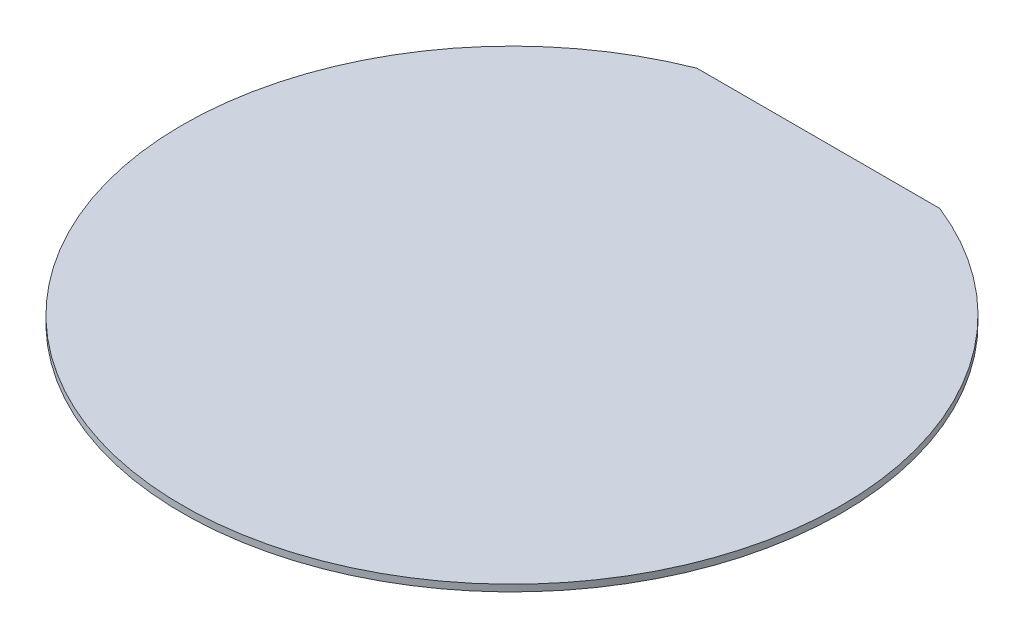
ISO-10303-21;
HEADER;
FILE_DESCRIPTION(('STEP AP214'),'2;1');
FILE_NAME('part.step','',(''),(''),'','','');
FILE_SCHEMA(('AUTOMOTIVE_DESIGN { 1 0 10303 214 1 1 1 1 }'));
ENDSEC;
DATA;
#1=APPLICATION_CONTEXT('core data for automotive mechanical design processes');
#2=APPLICATION_PROTOCOL_DEFINITION('international standard','automotive_design',2000,#1);
#3=PRODUCT_CONTEXT('',#1,'mechanical');
#4=PRODUCT('Part','Part','',(#3));
#5=PRODUCT_RELATED_PRODUCT_CATEGORY('part','',(#4));
#6=PRODUCT_DEFINITION_FORMATION('','',#4);
#7=PRODUCT_DEFINITION_CONTEXT('part definition',#1,'design');
#8=PRODUCT_DEFINITION('design','',#6,#7);
#9=PRODUCT_DEFINITION_SHAPE('','',#8);
#10=(LENGTH_UNIT() NAMED_UNIT(*) SI_UNIT(.MILLI.,.METRE.));
#11=(NAMED_UNIT(*) PLANE_ANGLE_UNIT() SI_UNIT($,.RADIAN.));
#12=(NAMED_UNIT(*) SI_UNIT($,.STERADIAN.) SOLID_ANGLE_UNIT());
#13=UNCERTAINTY_MEASURE_WITH_UNIT(LENGTH_MEASURE(1.E-05),#10,'distance_accuracy_value','');
#14=(GEOMETRIC_REPRESENTATION_CONTEXT(3) GLOBAL_UNCERTAINTY_ASSIGNED_CONTEXT((#13)) GLOBAL_UNIT_ASSIGNED_CONTEXT((#10,
#11,#12)) REPRESENTATION_CONTEXT('',''));
#15=CARTESIAN_POINT('',(0.,0.,0.));
#16=DIRECTION('',(0.,0.,1.));
#17=DIRECTION('',(1.,0.,0.));
#18=AXIS2_PLACEMENT_3D('',#15,#16,#17);
#19=CARTESIAN_POINT('',(0.,0.36,0.));
#20=DIRECTION('',(0.,-1.,0.));
#21=DIRECTION('',(0.,0.,-1.));
#22=AXIS2_PLACEMENT_3D('',#19,#20,#21);
#23=CYLINDRICAL_SURFACE('',#22,17.75);
#24=CARTESIAN_POINT('',(0.,0.,0.));
#25=DIRECTION('',(0.,1.,0.));
#26=DIRECTION('',(0.,0.,1.));
#27=AXIS2_PLACEMENT_3D('',#24,#25,#26);
#28=CIRCLE('',#27,17.75);
#29=CARTESIAN_POINT('',(-6.54312616415118,0.,-16.5));
#30=VERTEX_POINT('',#29);
#31=CARTESIAN_POINT('',(6.54312616415118,0.,-16.5));
#32=VERTEX_POINT('',#31);
#33=EDGE_CURVE('E57',#30,#32,#28,.T.);
#34=ORIENTED_EDGE('',*,*,#33,.T.);
#35=DIRECTION('',(0.,-1.,0.));
#36=VECTOR('',#35,1.);
#37=CARTESIAN_POINT('',(6.54312616415118,0.36,-16.5));
#38=LINE('',#37,#36);
#39=CARTESIAN_POINT('',(6.54312616415118,0.36,-16.5));
#40=VERTEX_POINT('',#39);
#41=EDGE_CURVE('E11',#40,#32,#38,.T.);
#42=ORIENTED_EDGE('',*,*,#41,.F.);
#43=CARTESIAN_POINT('',(0.,0.36,0.));
#44=DIRECTION('',(0.,1.,0.));
#45=DIRECTION('',(0.,0.,1.));
#46=AXIS2_PLACEMENT_3D('',#43,#44,#45);
#47=CIRCLE('',#46,17.75);
#48=CARTESIAN_POINT('',(-6.54312616415118,0.36,-16.5));
#49=VERTEX_POINT('',#48);
#50=EDGE_CURVE('E59',#49,#40,#47,.T.);
#51=ORIENTED_EDGE('',*,*,#50,.F.);
#52=DIRECTION('',(0.,-1.,0.));
#53=VECTOR('',#52,1.);
#54=CARTESIAN_POINT('',(-6.54312616415118,0.36,-16.5));
#55=LINE('',#54,#53);
#56=EDGE_CURVE('E41',#49,#30,#55,.T.);
#57=ORIENTED_EDGE('',*,*,#56,.T.);
#58=EDGE_LOOP('',(#34,#42,#51,#57));
#59=FACE_BOUND('',#58,.T.);
#60=ADVANCED_FACE('F33',(#59),#23,.T.);
#61=CARTESIAN_POINT('',(-6.54312616415118,0.36,-16.5));
#62=DIRECTION('',(0.,0.,-1.));
#63=DIRECTION('',(-1.,0.,0.));
#64=AXIS2_PLACEMENT_3D('',#61,#62,#63);
#65=PLANE('',#64);
#66=DIRECTION('',(1.,0.,0.));
#67=VECTOR('',#66,1.);
#68=CARTESIAN_POINT('',(-6.54312616415118,0.,-16.5));
#69=LINE('',#68,#67);
#70=EDGE_CURVE('E64',#30,#32,#69,.T.);
#71=ORIENTED_EDGE('',*,*,#70,.F.);
#72=ORIENTED_EDGE('',*,*,#56,.F.);
#73=DIRECTION('',(1.,0.,0.));
#74=VECTOR('',#73,1.);
#75=CARTESIAN_POINT('',(-6.54312616415118,0.36,-16.5));
#76=LINE('',#75,#74);
#77=EDGE_CURVE('E61',#49,#40,#76,.T.);
#78=ORIENTED_EDGE('',*,*,#77,.T.);
#79=ORIENTED_EDGE('',*,*,#41,.T.);
#80=EDGE_LOOP('',(#71,#72,#78,#79));
#81=FACE_BOUND('',#80,.T.);
#82=ADVANCED_FACE('F66',(#81),#65,.T.);
#83=CARTESIAN_POINT('',(0.,0.36,0.));
#84=DIRECTION('',(0.,1.,0.));
#85=DIRECTION('',(0.,0.,1.));
#86=AXIS2_PLACEMENT_3D('',#83,#84,#85);
#87=PLANE('',#86);
#88=ORIENTED_EDGE('',*,*,#50,.T.);
#89=ORIENTED_EDGE('',*,*,#77,.F.);
#90=EDGE_LOOP('',(#88,#89));
#91=FACE_BOUND('',#90,.T.);
#92=ADVANCED_FACE('F71',(#91),#87,.T.);
#93=CARTESIAN_POINT('',(0.,0.,0.));
#94=DIRECTION('',(0.,1.,0.));
#95=DIRECTION('',(0.,0.,1.));
#96=AXIS2_PLACEMENT_3D('',#93,#94,#95);
#97=PLANE('',#96);
#98=ORIENTED_EDGE('',*,*,#33,.F.);
#99=ORIENTED_EDGE('',*,*,#70,.T.);
#100=EDGE_LOOP('',(#98,#99));
#101=FACE_BOUND('',#100,.T.);
#102=ADVANCED_FACE('F63',(#101),#97,.F.);
#103=CLOSED_SHELL('',(#60,#82,#92,#102));
#104=MANIFOLD_SOLID_BREP('B2',#103);
#105=ADVANCED_BREP_SHAPE_REPRESENTATION('',(#18,#104),#14);
#106=SHAPE_DEFINITION_REPRESENTATION(#9,#105);
ENDSEC;
END-ISO-10303-21;
